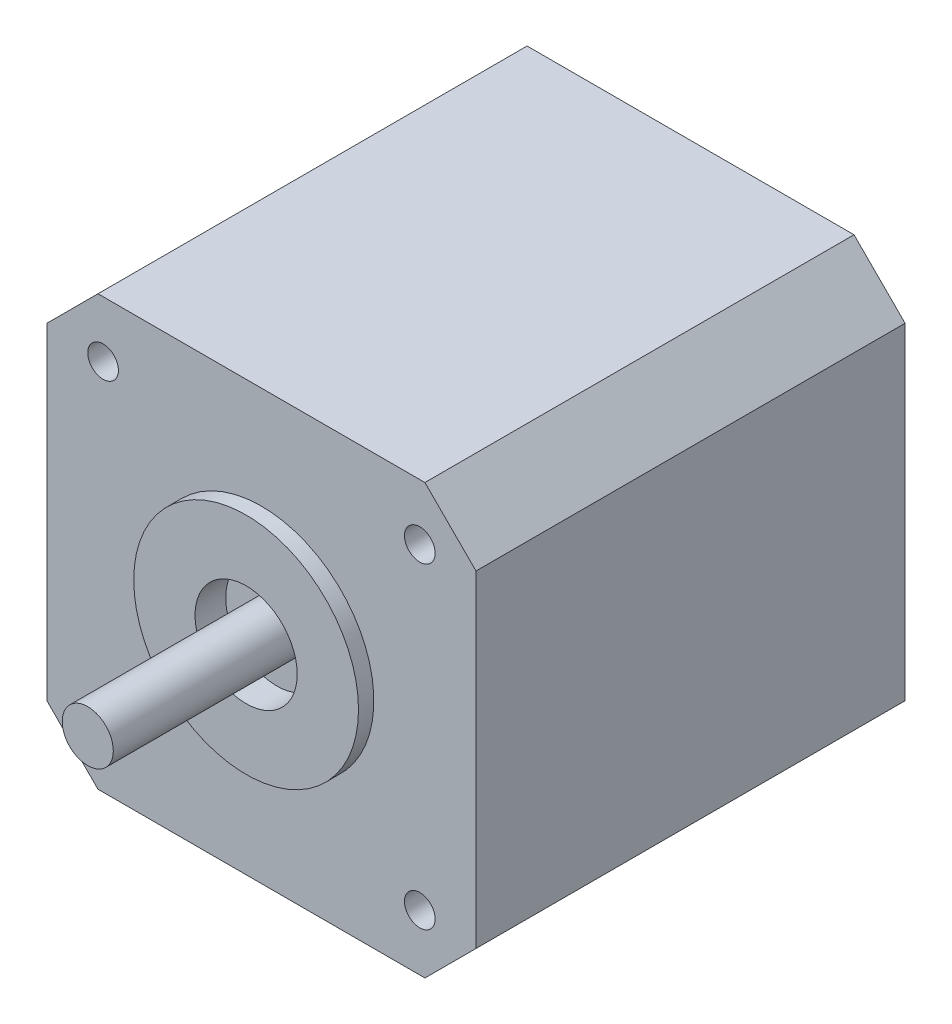
ISO-10303-21;
HEADER;
FILE_DESCRIPTION(('STEP AP214'),'2;1');
FILE_NAME('part.step','',(''),(''),'','','');
FILE_SCHEMA(('AUTOMOTIVE_DESIGN { 1 0 10303 214 1 1 1 1 }'));
ENDSEC;
DATA;
#1=APPLICATION_CONTEXT('core data for automotive mechanical design processes');
#2=APPLICATION_PROTOCOL_DEFINITION('international standard','automotive_design',2000,#1);
#3=PRODUCT_CONTEXT('',#1,'mechanical');
#4=PRODUCT('Part','Part','',(#3));
#5=PRODUCT_RELATED_PRODUCT_CATEGORY('part','',(#4));
#6=PRODUCT_DEFINITION_FORMATION('','',#4);
#7=PRODUCT_DEFINITION_CONTEXT('part definition',#1,'design');
#8=PRODUCT_DEFINITION('design','',#6,#7);
#9=PRODUCT_DEFINITION_SHAPE('','',#8);
#10=(LENGTH_UNIT() NAMED_UNIT(*) SI_UNIT(.MILLI.,.METRE.));
#11=(NAMED_UNIT(*) PLANE_ANGLE_UNIT() SI_UNIT($,.RADIAN.));
#12=(NAMED_UNIT(*) SI_UNIT($,.STERADIAN.) SOLID_ANGLE_UNIT());
#13=UNCERTAINTY_MEASURE_WITH_UNIT(LENGTH_MEASURE(1.E-05),#10,'distance_accuracy_value','');
#14=(GEOMETRIC_REPRESENTATION_CONTEXT(3) GLOBAL_UNCERTAINTY_ASSIGNED_CONTEXT((#13)) GLOBAL_UNIT_ASSIGNED_CONTEXT((#10,
#11,#12)) REPRESENTATION_CONTEXT('',''));
#15=CARTESIAN_POINT('',(0.,0.,0.));
#16=DIRECTION('',(0.,0.,1.));
#17=DIRECTION('',(1.,0.,0.));
#18=AXIS2_PLACEMENT_3D('',#15,#16,#17);
#19=CARTESIAN_POINT('',(21.,5.,21.));
#20=DIRECTION('',(0.707106781186547,-0.707106781186548,0.));
#21=DIRECTION('',(0.,0.,1.));
#22=AXIS2_PLACEMENT_3D('',#19,#20,#21);
#23=PLANE('',#22);
#24=DIRECTION('',(0.,0.,-1.));
#25=VECTOR('',#24,1.);
#26=CARTESIAN_POINT('',(21.,5.,21.));
#27=LINE('',#26,#25);
#28=CARTESIAN_POINT('',(21.,5.00000000000001,21.));
#29=VERTEX_POINT('',#28);
#30=CARTESIAN_POINT('',(21.,5.00000000000001,-21.));
#31=VERTEX_POINT('',#30);
#32=EDGE_CURVE('E189',#29,#31,#27,.T.);
#33=ORIENTED_EDGE('',*,*,#32,.F.);
#34=DIRECTION('',(0.707106781186548,0.707106781186547,0.));
#35=VECTOR('',#34,1.);
#36=CARTESIAN_POINT('',(21.,5.,21.));
#37=LINE('',#36,#35);
#38=CARTESIAN_POINT('',(16.,0.,21.));
#39=VERTEX_POINT('',#38);
#40=EDGE_CURVE('E53',#39,#29,#37,.T.);
#41=ORIENTED_EDGE('',*,*,#40,.F.);
#42=DIRECTION('',(0.,0.,1.));
#43=VECTOR('',#42,1.);
#44=CARTESIAN_POINT('',(16.,0.,21.));
#45=LINE('',#44,#43);
#46=CARTESIAN_POINT('',(16.,0.,-21.));
#47=VERTEX_POINT('',#46);
#48=EDGE_CURVE('E192',#47,#39,#45,.T.);
#49=ORIENTED_EDGE('',*,*,#48,.F.);
#50=DIRECTION('',(-0.707106781186548,-0.707106781186547,0.));
#51=VECTOR('',#50,1.);
#52=CARTESIAN_POINT('',(21.,5.,-21.));
#53=LINE('',#52,#51);
#54=EDGE_CURVE('E13',#31,#47,#53,.T.);
#55=ORIENTED_EDGE('',*,*,#54,.F.);
#56=EDGE_LOOP('',(#33,#41,#49,#55));
#57=FACE_BOUND('',#56,.T.);
#58=ADVANCED_FACE('F46',(#57),#23,.T.);
#59=CARTESIAN_POINT('',(-21.,5.,21.));
#60=DIRECTION('',(-0.707106781186547,-0.707106781186548,0.));
#61=DIRECTION('',(0.,0.,-1.));
#62=AXIS2_PLACEMENT_3D('',#59,#60,#61);
#63=PLANE('',#62);
#64=DIRECTION('',(0.,0.,1.));
#65=VECTOR('',#64,1.);
#66=CARTESIAN_POINT('',(-21.,5.,-21.));
#67=LINE('',#66,#65);
#68=CARTESIAN_POINT('',(-21.,5.00000000000001,-21.));
#69=VERTEX_POINT('',#68);
#70=CARTESIAN_POINT('',(-21.,5.00000000000001,21.));
#71=VERTEX_POINT('',#70);
#72=EDGE_CURVE('E179',#69,#71,#67,.T.);
#73=ORIENTED_EDGE('',*,*,#72,.F.);
#74=DIRECTION('',(-0.707106781186548,0.707106781186547,0.));
#75=VECTOR('',#74,1.);
#76=CARTESIAN_POINT('',(-21.,5.,-21.));
#77=LINE('',#76,#75);
#78=CARTESIAN_POINT('',(-16.,0.,-21.));
#79=VERTEX_POINT('',#78);
#80=EDGE_CURVE('E185',#79,#69,#77,.T.);
#81=ORIENTED_EDGE('',*,*,#80,.F.);
#82=DIRECTION('',(0.,0.,-1.));
#83=VECTOR('',#82,1.);
#84=CARTESIAN_POINT('',(-16.,0.,-21.));
#85=LINE('',#84,#83);
#86=CARTESIAN_POINT('',(-16.,0.,21.));
#87=VERTEX_POINT('',#86);
#88=EDGE_CURVE('E182',#87,#79,#85,.T.);
#89=ORIENTED_EDGE('',*,*,#88,.F.);
#90=DIRECTION('',(0.707106781186548,-0.707106781186547,0.));
#91=VECTOR('',#90,1.);
#92=CARTESIAN_POINT('',(-21.,5.,21.));
#93=LINE('',#92,#91);
#94=EDGE_CURVE('E187',#71,#87,#93,.T.);
#95=ORIENTED_EDGE('',*,*,#94,.F.);
#96=EDGE_LOOP('',(#73,#81,#89,#95));
#97=FACE_BOUND('',#96,.T.);
#98=ADVANCED_FACE('F214',(#97),#63,.T.);
#99=CARTESIAN_POINT('',(-16.,42.,0.));
#100=DIRECTION('',(0.707106781186547,-0.707106781186548,0.));
#101=DIRECTION('',(0.,0.,1.));
#102=AXIS2_PLACEMENT_3D('',#99,#100,#101);
#103=PLANE('',#102);
#104=DIRECTION('',(0.,0.,1.));
#105=VECTOR('',#104,1.);
#106=CARTESIAN_POINT('',(-16.,42.,0.));
#107=LINE('',#106,#105);
#108=CARTESIAN_POINT('',(-16.,42.,-21.));
#109=VERTEX_POINT('',#108);
#110=CARTESIAN_POINT('',(-16.,42.,21.));
#111=VERTEX_POINT('',#110);
#112=EDGE_CURVE('E115',#109,#111,#107,.T.);
#113=ORIENTED_EDGE('',*,*,#112,.F.);
#114=DIRECTION('',(-0.707106781186548,-0.707106781186547,0.));
#115=VECTOR('',#114,1.);
#116=CARTESIAN_POINT('',(-16.,42.,-21.));
#117=LINE('',#116,#115);
#118=CARTESIAN_POINT('',(-21.,37.,-21.));
#119=VERTEX_POINT('',#118);
#120=EDGE_CURVE('E130',#119,#109,#117,.F.);
#121=ORIENTED_EDGE('',*,*,#120,.F.);
#122=DIRECTION('',(0.,0.,-1.));
#123=VECTOR('',#122,1.);
#124=CARTESIAN_POINT('',(-21.,37.,21.));
#125=LINE('',#124,#123);
#126=CARTESIAN_POINT('',(-21.,37.,21.));
#127=VERTEX_POINT('',#126);
#128=EDGE_CURVE('E173',#127,#119,#125,.T.);
#129=ORIENTED_EDGE('',*,*,#128,.F.);
#130=DIRECTION('',(0.707106781186548,0.707106781186547,0.));
#131=VECTOR('',#130,1.);
#132=CARTESIAN_POINT('',(-16.,42.,21.));
#133=LINE('',#132,#131);
#134=EDGE_CURVE('E177',#111,#127,#133,.F.);
#135=ORIENTED_EDGE('',*,*,#134,.F.);
#136=EDGE_LOOP('',(#113,#121,#129,#135));
#137=FACE_BOUND('',#136,.T.);
#138=ADVANCED_FACE('F218',(#137),#103,.F.);
#139=CARTESIAN_POINT('',(16.,42.,0.));
#140=DIRECTION('',(-0.707106781186547,-0.707106781186548,0.));
#141=DIRECTION('',(0.,0.,-1.));
#142=AXIS2_PLACEMENT_3D('',#139,#140,#141);
#143=PLANE('',#142);
#144=DIRECTION('',(0.,0.,-1.));
#145=VECTOR('',#144,1.);
#146=CARTESIAN_POINT('',(16.,42.,0.));
#147=LINE('',#146,#145);
#148=CARTESIAN_POINT('',(16.,42.,21.));
#149=VERTEX_POINT('',#148);
#150=CARTESIAN_POINT('',(16.,42.,-21.));
#151=VERTEX_POINT('',#150);
#152=EDGE_CURVE('E110',#149,#151,#147,.T.);
#153=ORIENTED_EDGE('',*,*,#152,.F.);
#154=DIRECTION('',(0.707106781186548,-0.707106781186547,0.));
#155=VECTOR('',#154,1.);
#156=CARTESIAN_POINT('',(16.,42.,21.));
#157=LINE('',#156,#155);
#158=CARTESIAN_POINT('',(21.,37.,21.));
#159=VERTEX_POINT('',#158);
#160=EDGE_CURVE('E116',#159,#149,#157,.F.);
#161=ORIENTED_EDGE('',*,*,#160,.F.);
#162=DIRECTION('',(0.,0.,1.));
#163=VECTOR('',#162,1.);
#164=CARTESIAN_POINT('',(21.,37.,21.));
#165=LINE('',#164,#163);
#166=CARTESIAN_POINT('',(21.,37.,-21.));
#167=VERTEX_POINT('',#166);
#168=EDGE_CURVE('E112',#167,#159,#165,.T.);
#169=ORIENTED_EDGE('',*,*,#168,.F.);
#170=DIRECTION('',(-0.707106781186548,0.707106781186547,0.));
#171=VECTOR('',#170,1.);
#172=CARTESIAN_POINT('',(16.,42.,-21.));
#173=LINE('',#172,#171);
#174=EDGE_CURVE('E107',#151,#167,#173,.F.);
#175=ORIENTED_EDGE('',*,*,#174,.F.);
#176=EDGE_LOOP('',(#153,#161,#169,#175));
#177=FACE_BOUND('',#176,.T.);
#178=ADVANCED_FACE('F109',(#177),#143,.F.);
#179=CARTESIAN_POINT('',(15.5,36.5,-21.));
#180=DIRECTION('',(0.,0.,1.));
#181=DIRECTION('',(1.,0.,0.));
#182=AXIS2_PLACEMENT_3D('',#179,#180,#181);
#183=CYLINDRICAL_SURFACE('',#182,1.5);
#184=CARTESIAN_POINT('',(15.5,36.5,21.));
#185=DIRECTION('',(0.,0.,1.));
#186=DIRECTION('',(1.,0.,0.));
#187=AXIS2_PLACEMENT_3D('',#184,#185,#186);
#188=CIRCLE('',#187,1.5);
#189=CARTESIAN_POINT('',(17.,36.5,21.));
#190=VERTEX_POINT('',#189);
#191=EDGE_CURVE('E140',#190,#190,#188,.T.);
#192=CARTESIAN_POINT('',(15.5,36.5,-19.));
#193=DIRECTION('',(0.,0.,-1.));
#194=DIRECTION('',(-1.,0.,0.));
#195=AXIS2_PLACEMENT_3D('',#192,#193,#194);
#196=CIRCLE('',#195,1.5);
#197=CARTESIAN_POINT('',(17.,36.5,-19.));
#198=VERTEX_POINT('',#197);
#199=EDGE_CURVE('E166',#198,#198,#196,.F.);
#200=CARTESIAN_POINT('',(17.,36.5,21.));
#201=CARTESIAN_POINT('',(17.,36.5,20.5833333333333));
#202=CARTESIAN_POINT('',(17.,36.5,20.1666666666667));
#203=CARTESIAN_POINT('',(17.,36.5,19.3333333333333));
#204=CARTESIAN_POINT('',(17.,36.5,18.9166666666667));
#205=CARTESIAN_POINT('',(17.,36.5,18.0833333333333));
#206=CARTESIAN_POINT('',(17.,36.5,17.6666666666667));
#207=CARTESIAN_POINT('',(17.,36.5,16.8333333333333));
#208=CARTESIAN_POINT('',(17.,36.5,16.4166666666667));
#209=CARTESIAN_POINT('',(17.,36.5,15.5833333333333));
#210=CARTESIAN_POINT('',(17.,36.5,15.1666666666667));
#211=CARTESIAN_POINT('',(17.,36.5,14.3333333333333));
#212=CARTESIAN_POINT('',(17.,36.5,13.9166666666667));
#213=CARTESIAN_POINT('',(17.,36.5,13.0833333333333));
#214=CARTESIAN_POINT('',(17.,36.5,12.6666666666667));
#215=CARTESIAN_POINT('',(17.,36.5,11.8333333333333));
#216=CARTESIAN_POINT('',(17.,36.5,11.4166666666667));
#217=CARTESIAN_POINT('',(17.,36.5,10.5833333333333));
#218=CARTESIAN_POINT('',(17.,36.5,10.1666666666667));
#219=CARTESIAN_POINT('',(17.,36.5,9.33333333333333));
#220=CARTESIAN_POINT('',(17.,36.5,8.91666666666667));
#221=CARTESIAN_POINT('',(17.,36.5,8.08333333333333));
#222=CARTESIAN_POINT('',(17.,36.5,7.66666666666667));
#223=CARTESIAN_POINT('',(17.,36.5,6.83333333333334));
#224=CARTESIAN_POINT('',(17.,36.5,6.41666666666667));
#225=CARTESIAN_POINT('',(17.,36.5,5.58333333333333));
#226=CARTESIAN_POINT('',(17.,36.5,5.16666666666667));
#227=CARTESIAN_POINT('',(17.,36.5,4.33333333333333));
#228=CARTESIAN_POINT('',(17.,36.5,3.91666666666667));
#229=CARTESIAN_POINT('',(17.,36.5,3.08333333333334));
#230=CARTESIAN_POINT('',(17.,36.5,2.66666666666667));
#231=CARTESIAN_POINT('',(17.,36.5,1.83333333333334));
#232=CARTESIAN_POINT('',(17.,36.5,1.41666666666667));
#233=CARTESIAN_POINT('',(17.,36.5,0.583333333333334));
#234=CARTESIAN_POINT('',(17.,36.5,0.166666666666667));
#235=CARTESIAN_POINT('',(17.,36.5,-0.666666666666667));
#236=CARTESIAN_POINT('',(17.,36.5,-1.08333333333333));
#237=CARTESIAN_POINT('',(17.,36.5,-1.91666666666667));
#238=CARTESIAN_POINT('',(17.,36.5,-2.33333333333333));
#239=CARTESIAN_POINT('',(17.,36.5,-3.16666666666667));
#240=CARTESIAN_POINT('',(17.,36.5,-3.58333333333333));
#241=CARTESIAN_POINT('',(17.,36.5,-4.41666666666667));
#242=CARTESIAN_POINT('',(17.,36.5,-4.83333333333333));
#243=CARTESIAN_POINT('',(17.,36.5,-5.66666666666667));
#244=CARTESIAN_POINT('',(17.,36.5,-6.08333333333333));
#245=CARTESIAN_POINT('',(17.,36.5,-6.91666666666666));
#246=CARTESIAN_POINT('',(17.,36.5,-7.33333333333333));
#247=CARTESIAN_POINT('',(17.,36.5,-8.16666666666667));
#248=CARTESIAN_POINT('',(17.,36.5,-8.58333333333333));
#249=CARTESIAN_POINT('',(17.,36.5,-9.41666666666667));
#250=CARTESIAN_POINT('',(17.,36.5,-9.83333333333333));
#251=CARTESIAN_POINT('',(17.,36.5,-10.6666666666667));
#252=CARTESIAN_POINT('',(17.,36.5,-11.0833333333333));
#253=CARTESIAN_POINT('',(17.,36.5,-11.9166666666667));
#254=CARTESIAN_POINT('',(17.,36.5,-12.3333333333333));
#255=CARTESIAN_POINT('',(17.,36.5,-13.1666666666667));
#256=CARTESIAN_POINT('',(17.,36.5,-13.5833333333333));
#257=CARTESIAN_POINT('',(17.,36.5,-14.4166666666667));
#258=CARTESIAN_POINT('',(17.,36.5,-14.8333333333333));
#259=CARTESIAN_POINT('',(17.,36.5,-15.6666666666667));
#260=CARTESIAN_POINT('',(17.,36.5,-16.0833333333333));
#261=CARTESIAN_POINT('',(17.,36.5,-16.9166666666667));
#262=CARTESIAN_POINT('',(17.,36.5,-17.3333333333333));
#263=CARTESIAN_POINT('',(17.,36.5,-18.1666666666667));
#264=CARTESIAN_POINT('',(17.,36.5,-18.5833333333333));
#265=CARTESIAN_POINT('',(17.,36.5,-19.));
#266=B_SPLINE_CURVE_WITH_KNOTS('',3,(#200,#201,#202,#203,#204,#205,#206,#207,#208,#209,#210,
#211,#212,#213,#214,#215,#216,#217,#218,#219,#220,#221,#222,#223,#224,#225,#226,#227,#228,#229,
#230,#231,#232,#233,#234,#235,#236,#237,#238,#239,#240,#241,#242,#243,#244,#245,#246,#247,#248,
#249,#250,#251,#252,#253,#254,#255,#256,#257,#258,#259,#260,#261,#262,#263,#264,#265),
.UNSPECIFIED.,.F.,.F.,(4,2,2,2,2,2,2,2,2,2,2,2,2,2,2,2,2,2,2,2,2,2,2,2,2,2,2,2,2,2,2,2,4),(0.,
1.25,2.5,3.75,5.,6.25,7.5,8.75,10.,11.25,12.5,13.75,15.,16.25,17.5,18.75,20.,21.25,22.5,23.75,
25.,26.25,27.5,28.75,30.,31.25,32.5,33.75,35.,36.25,37.5,38.75,40.),.UNSPECIFIED.);
#267=EDGE_CURVE('BSEAM209',#190,#198,#266,.T.);
#268=ORIENTED_EDGE('',*,*,#191,.T.);
#269=ORIENTED_EDGE('',*,*,#199,.F.);
#270=ORIENTED_EDGE('',*,*,#267,.T.);
#271=ORIENTED_EDGE('',*,*,#267,.F.);
#272=EDGE_LOOP('',(#268,#270,#269,#271));
#273=FACE_BOUND('',#272,.T.);
#274=ADVANCED_FACE('F209',(#273),#183,.F.);
#275=CARTESIAN_POINT('',(-15.5,5.50000000000001,-21.));
#276=DIRECTION('',(0.,0.,1.));
#277=DIRECTION('',(1.,0.,0.));
#278=AXIS2_PLACEMENT_3D('',#275,#276,#277);
#279=CYLINDRICAL_SURFACE('',#278,1.5);
#280=CARTESIAN_POINT('',(-15.5,5.50000000000001,21.));
#281=DIRECTION('',(0.,0.,1.));
#282=DIRECTION('',(1.,0.,0.));
#283=AXIS2_PLACEMENT_3D('',#280,#281,#282);
#284=CIRCLE('',#283,1.5);
#285=CARTESIAN_POINT('',(-14.,5.50000000000001,21.));
#286=VERTEX_POINT('',#285);
#287=EDGE_CURVE('E519',#286,#286,#284,.T.);
#288=CARTESIAN_POINT('',(-15.5,5.50000000000001,-19.));
#289=DIRECTION('',(0.,0.,-1.));
#290=DIRECTION('',(-1.,0.,0.));
#291=AXIS2_PLACEMENT_3D('',#288,#289,#290);
#292=CIRCLE('',#291,1.5);
#293=CARTESIAN_POINT('',(-14.,5.50000000000001,-19.));
#294=VERTEX_POINT('',#293);
#295=EDGE_CURVE('E163',#294,#294,#292,.F.);
#296=CARTESIAN_POINT('',(-14.,5.50000000000001,21.));
#297=CARTESIAN_POINT('',(-14.,5.50000000000001,20.5833333333333));
#298=CARTESIAN_POINT('',(-14.,5.50000000000001,20.1666666666667));
#299=CARTESIAN_POINT('',(-14.,5.50000000000001,19.3333333333333));
#300=CARTESIAN_POINT('',(-14.,5.50000000000001,18.9166666666667));
#301=CARTESIAN_POINT('',(-14.,5.50000000000001,18.0833333333333));
#302=CARTESIAN_POINT('',(-14.,5.50000000000001,17.6666666666667));
#303=CARTESIAN_POINT('',(-14.,5.50000000000001,16.8333333333333));
#304=CARTESIAN_POINT('',(-14.,5.50000000000001,16.4166666666667));
#305=CARTESIAN_POINT('',(-14.,5.50000000000001,15.5833333333333));
#306=CARTESIAN_POINT('',(-14.,5.50000000000001,15.1666666666667));
#307=CARTESIAN_POINT('',(-14.,5.50000000000001,14.3333333333333));
#308=CARTESIAN_POINT('',(-14.,5.50000000000001,13.9166666666667));
#309=CARTESIAN_POINT('',(-14.,5.50000000000001,13.0833333333333));
#310=CARTESIAN_POINT('',(-14.,5.50000000000001,12.6666666666667));
#311=CARTESIAN_POINT('',(-14.,5.50000000000001,11.8333333333333));
#312=CARTESIAN_POINT('',(-14.,5.50000000000001,11.4166666666667));
#313=CARTESIAN_POINT('',(-14.,5.50000000000001,10.5833333333333));
#314=CARTESIAN_POINT('',(-14.,5.50000000000001,10.1666666666667));
#315=CARTESIAN_POINT('',(-14.,5.50000000000001,9.33333333333333));
#316=CARTESIAN_POINT('',(-14.,5.50000000000001,8.91666666666667));
#317=CARTESIAN_POINT('',(-14.,5.50000000000001,8.08333333333333));
#318=CARTESIAN_POINT('',(-14.,5.50000000000001,7.66666666666667));
#319=CARTESIAN_POINT('',(-14.,5.50000000000001,6.83333333333334));
#320=CARTESIAN_POINT('',(-14.,5.50000000000001,6.41666666666667));
#321=CARTESIAN_POINT('',(-14.,5.50000000000001,5.58333333333333));
#322=CARTESIAN_POINT('',(-14.,5.50000000000001,5.16666666666667));
#323=CARTESIAN_POINT('',(-14.,5.50000000000001,4.33333333333333));
#324=CARTESIAN_POINT('',(-14.,5.50000000000001,3.91666666666667));
#325=CARTESIAN_POINT('',(-14.,5.50000000000001,3.08333333333334));
#326=CARTESIAN_POINT('',(-14.,5.50000000000001,2.66666666666667));
#327=CARTESIAN_POINT('',(-14.,5.50000000000001,1.83333333333334));
#328=CARTESIAN_POINT('',(-14.,5.50000000000001,1.41666666666667));
#329=CARTESIAN_POINT('',(-14.,5.50000000000001,0.583333333333334));
#330=CARTESIAN_POINT('',(-14.,5.50000000000001,0.166666666666667));
#331=CARTESIAN_POINT('',(-14.,5.50000000000001,-0.666666666666667));
#332=CARTESIAN_POINT('',(-14.,5.50000000000001,-1.08333333333333));
#333=CARTESIAN_POINT('',(-14.,5.50000000000001,-1.91666666666667));
#334=CARTESIAN_POINT('',(-14.,5.50000000000001,-2.33333333333333));
#335=CARTESIAN_POINT('',(-14.,5.50000000000001,-3.16666666666667));
#336=CARTESIAN_POINT('',(-14.,5.50000000000001,-3.58333333333333));
#337=CARTESIAN_POINT('',(-14.,5.50000000000001,-4.41666666666667));
#338=CARTESIAN_POINT('',(-14.,5.50000000000001,-4.83333333333333));
#339=CARTESIAN_POINT('',(-14.,5.50000000000001,-5.66666666666667));
#340=CARTESIAN_POINT('',(-14.,5.50000000000001,-6.08333333333333));
#341=CARTESIAN_POINT('',(-14.,5.50000000000001,-6.91666666666666));
#342=CARTESIAN_POINT('',(-14.,5.50000000000001,-7.33333333333333));
#343=CARTESIAN_POINT('',(-14.,5.50000000000001,-8.16666666666667));
#344=CARTESIAN_POINT('',(-14.,5.50000000000001,-8.58333333333333));
#345=CARTESIAN_POINT('',(-14.,5.50000000000001,-9.41666666666667));
#346=CARTESIAN_POINT('',(-14.,5.50000000000001,-9.83333333333333));
#347=CARTESIAN_POINT('',(-14.,5.50000000000001,-10.6666666666667));
#348=CARTESIAN_POINT('',(-14.,5.50000000000001,-11.0833333333333));
#349=CARTESIAN_POINT('',(-14.,5.50000000000001,-11.9166666666667));
#350=CARTESIAN_POINT('',(-14.,5.50000000000001,-12.3333333333333));
#351=CARTESIAN_POINT('',(-14.,5.50000000000001,-13.1666666666667));
#352=CARTESIAN_POINT('',(-14.,5.50000000000001,-13.5833333333333));
#353=CARTESIAN_POINT('',(-14.,5.50000000000001,-14.4166666666667));
#354=CARTESIAN_POINT('',(-14.,5.50000000000001,-14.8333333333333));
#355=CARTESIAN_POINT('',(-14.,5.50000000000001,-15.6666666666667));
#356=CARTESIAN_POINT('',(-14.,5.50000000000001,-16.0833333333333));
#357=CARTESIAN_POINT('',(-14.,5.50000000000001,-16.9166666666667));
#358=CARTESIAN_POINT('',(-14.,5.50000000000001,-17.3333333333333));
#359=CARTESIAN_POINT('',(-14.,5.50000000000001,-18.1666666666667));
#360=CARTESIAN_POINT('',(-14.,5.50000000000001,-18.5833333333333));
#361=CARTESIAN_POINT('',(-14.,5.50000000000001,-19.));
#362=B_SPLINE_CURVE_WITH_KNOTS('',3,(#296,#297,#298,#299,#300,#301,#302,#303,#304,#305,#306,
#307,#308,#309,#310,#311,#312,#313,#314,#315,#316,#317,#318,#319,#320,#321,#322,#323,#324,#325,
#326,#327,#328,#329,#330,#331,#332,#333,#334,#335,#336,#337,#338,#339,#340,#341,#342,#343,#344,
#345,#346,#347,#348,#349,#350,#351,#352,#353,#354,#355,#356,#357,#358,#359,#360,#361),
.UNSPECIFIED.,.F.,.F.,(4,2,2,2,2,2,2,2,2,2,2,2,2,2,2,2,2,2,2,2,2,2,2,2,2,2,2,2,2,2,2,2,4),(0.,
1.25,2.5,3.75,5.,6.25,7.5,8.75,10.,11.25,12.5,13.75,15.,16.25,17.5,18.75,20.,21.25,22.5,23.75,
25.,26.25,27.5,28.75,30.,31.25,32.5,33.75,35.,36.25,37.5,38.75,40.),.UNSPECIFIED.);
#363=EDGE_CURVE('BSEAM200',#286,#294,#362,.T.);
#364=ORIENTED_EDGE('',*,*,#287,.T.);
#365=ORIENTED_EDGE('',*,*,#295,.F.);
#366=ORIENTED_EDGE('',*,*,#363,.T.);
#367=ORIENTED_EDGE('',*,*,#363,.F.);
#368=EDGE_LOOP('',(#364,#366,#365,#367));
#369=FACE_BOUND('',#368,.T.);
#370=ADVANCED_FACE('F200',(#369),#279,.F.);
#371=CARTESIAN_POINT('',(21.,42.,21.));
#372=DIRECTION('',(-1.,0.,0.));
#373=DIRECTION('',(0.,0.,1.));
#374=AXIS2_PLACEMENT_3D('',#371,#372,#373);
#375=PLANE('',#374);
#376=DIRECTION('',(0.,-1.,0.));
#377=VECTOR('',#376,1.);
#378=CARTESIAN_POINT('',(21.,42.,21.));
#379=LINE('',#378,#377);
#380=EDGE_CURVE('E134',#159,#29,#379,.T.);
#381=ORIENTED_EDGE('',*,*,#380,.T.);
#382=ORIENTED_EDGE('',*,*,#32,.T.);
#383=DIRECTION('',(0.,-1.,0.));
#384=VECTOR('',#383,1.);
#385=CARTESIAN_POINT('',(21.,42.,-21.));
#386=LINE('',#385,#384);
#387=EDGE_CURVE('E152',#167,#31,#386,.T.);
#388=ORIENTED_EDGE('',*,*,#387,.F.);
#389=ORIENTED_EDGE('',*,*,#168,.T.);
#390=EDGE_LOOP('',(#381,#382,#388,#389));
#391=FACE_BOUND('',#390,.T.);
#392=ADVANCED_FACE('F198',(#391),#375,.F.);
#393=CARTESIAN_POINT('',(-21.,42.,-21.));
#394=DIRECTION('',(0.,0.,1.));
#395=DIRECTION('',(1.,0.,0.));
#396=AXIS2_PLACEMENT_3D('',#393,#394,#395);
#397=PLANE('',#396);
#398=CARTESIAN_POINT('',(-15.5,36.5,-21.));
#399=DIRECTION('',(0.,0.,-1.));
#400=DIRECTION('',(1.,0.,0.));
#401=AXIS2_PLACEMENT_3D('',#398,#399,#400);
#402=CIRCLE('',#401,3.);
#403=CARTESIAN_POINT('',(-12.5,36.5,-21.));
#404=VERTEX_POINT('',#403);
#405=EDGE_CURVE('E493',#404,#404,#402,.T.);
#406=ORIENTED_EDGE('',*,*,#405,.F.);
#407=EDGE_LOOP('',(#406));
#408=FACE_BOUND('',#407,.T.);
#409=CARTESIAN_POINT('',(15.5,5.50000000000001,-21.));
#410=DIRECTION('',(0.,0.,-1.));
#411=DIRECTION('',(1.,0.,0.));
#412=AXIS2_PLACEMENT_3D('',#409,#410,#411);
#413=CIRCLE('',#412,3.);
#414=CARTESIAN_POINT('',(18.5,5.50000000000001,-21.));
#415=VERTEX_POINT('',#414);
#416=EDGE_CURVE('E486',#415,#415,#413,.T.);
#417=ORIENTED_EDGE('',*,*,#416,.F.);
#418=EDGE_LOOP('',(#417));
#419=FACE_BOUND('',#418,.T.);
#420=CARTESIAN_POINT('',(15.5,36.5,-21.));
#421=DIRECTION('',(0.,0.,-1.));
#422=DIRECTION('',(-1.,0.,0.));
#423=AXIS2_PLACEMENT_3D('',#420,#421,#422);
#424=CIRCLE('',#423,3.);
#425=CARTESIAN_POINT('',(12.5,36.5,-21.));
#426=VERTEX_POINT('',#425);
#427=EDGE_CURVE('E483',#426,#426,#424,.T.);
#428=ORIENTED_EDGE('',*,*,#427,.F.);
#429=EDGE_LOOP('',(#428));
#430=FACE_BOUND('',#429,.T.);
#431=CARTESIAN_POINT('',(-15.5,5.50000000000001,-21.));
#432=DIRECTION('',(0.,0.,-1.));
#433=DIRECTION('',(-1.,0.,0.));
#434=AXIS2_PLACEMENT_3D('',#431,#432,#433);
#435=CIRCLE('',#434,3.);
#436=CARTESIAN_POINT('',(-18.5,5.50000000000001,-21.));
#437=VERTEX_POINT('',#436);
#438=EDGE_CURVE('E492',#437,#437,#435,.T.);
#439=ORIENTED_EDGE('',*,*,#438,.F.);
#440=EDGE_LOOP('',(#439));
#441=FACE_BOUND('',#440,.T.);
#442=ORIENTED_EDGE('',*,*,#387,.T.);
#443=ORIENTED_EDGE('',*,*,#54,.T.);
#444=DIRECTION('',(-1.,0.,0.));
#445=VECTOR('',#444,1.);
#446=CARTESIAN_POINT('',(-21.,0.,-21.));
#447=LINE('',#446,#445);
#448=EDGE_CURVE('E137',#47,#79,#447,.T.);
#449=ORIENTED_EDGE('',*,*,#448,.T.);
#450=ORIENTED_EDGE('',*,*,#80,.T.);
#451=DIRECTION('',(0.,-1.,0.));
#452=VECTOR('',#451,1.);
#453=CARTESIAN_POINT('',(-21.,42.,-21.));
#454=LINE('',#453,#452);
#455=EDGE_CURVE('E149',#119,#69,#454,.T.);
#456=ORIENTED_EDGE('',*,*,#455,.F.);
#457=ORIENTED_EDGE('',*,*,#120,.T.);
#458=DIRECTION('',(-1.,0.,0.));
#459=VECTOR('',#458,1.);
#460=CARTESIAN_POINT('',(-21.,42.,-21.));
#461=LINE('',#460,#459);
#462=EDGE_CURVE('E122',#151,#109,#461,.T.);
#463=ORIENTED_EDGE('',*,*,#462,.F.);
#464=ORIENTED_EDGE('',*,*,#174,.T.);
#465=EDGE_LOOP('',(#442,#443,#449,#450,#456,#457,#463,#464));
#466=FACE_BOUND('',#465,.T.);
#467=ADVANCED_FACE('F128',(#408,#419,#430,#441,#466),#397,.F.);
#468=CARTESIAN_POINT('',(-21.,42.,21.));
#469=DIRECTION('',(1.,0.,0.));
#470=DIRECTION('',(0.,0.,-1.));
#471=AXIS2_PLACEMENT_3D('',#468,#469,#470);
#472=PLANE('',#471);
#473=ORIENTED_EDGE('',*,*,#455,.T.);
#474=ORIENTED_EDGE('',*,*,#72,.T.);
#475=DIRECTION('',(0.,-1.,0.));
#476=VECTOR('',#475,1.);
#477=CARTESIAN_POINT('',(-21.,42.,21.));
#478=LINE('',#477,#476);
#479=EDGE_CURVE('E146',#127,#71,#478,.T.);
#480=ORIENTED_EDGE('',*,*,#479,.F.);
#481=ORIENTED_EDGE('',*,*,#128,.T.);
#482=EDGE_LOOP('',(#473,#474,#480,#481));
#483=FACE_BOUND('',#482,.T.);
#484=ADVANCED_FACE('F206',(#483),#472,.F.);
#485=CARTESIAN_POINT('',(-21.,42.,21.));
#486=DIRECTION('',(0.,0.,-1.));
#487=DIRECTION('',(-1.,0.,0.));
#488=AXIS2_PLACEMENT_3D('',#485,#486,#487);
#489=PLANE('',#488);
#490=CARTESIAN_POINT('',(0.,21.,21.));
#491=DIRECTION('',(0.,0.,-1.));
#492=DIRECTION('',(-1.,0.,0.));
#493=AXIS2_PLACEMENT_3D('',#490,#491,#492);
#494=CIRCLE('',#493,11.);
#495=CARTESIAN_POINT('',(-11.,21.,21.));
#496=VERTEX_POINT('',#495);
#497=EDGE_CURVE('E126',#496,#496,#494,.F.);
#498=ORIENTED_EDGE('',*,*,#497,.F.);
#499=EDGE_LOOP('',(#498));
#500=FACE_BOUND('',#499,.T.);
#501=CARTESIAN_POINT('',(-15.5,36.5,21.));
#502=DIRECTION('',(0.,0.,1.));
#503=DIRECTION('',(-1.,0.,0.));
#504=AXIS2_PLACEMENT_3D('',#501,#502,#503);
#505=CIRCLE('',#504,1.5);
#506=CARTESIAN_POINT('',(-14.,36.5,21.));
#507=VERTEX_POINT('',#506);
#508=EDGE_CURVE('E523',#507,#507,#505,.T.);
#509=ORIENTED_EDGE('',*,*,#508,.F.);
#510=EDGE_LOOP('',(#509));
#511=FACE_BOUND('',#510,.T.);
#512=CARTESIAN_POINT('',(15.5,5.50000000000001,21.));
#513=DIRECTION('',(0.,0.,1.));
#514=DIRECTION('',(-1.,0.,0.));
#515=AXIS2_PLACEMENT_3D('',#512,#513,#514);
#516=CIRCLE('',#515,1.5);
#517=CARTESIAN_POINT('',(17.,5.50000000000001,21.));
#518=VERTEX_POINT('',#517);
#519=EDGE_CURVE('E522',#518,#518,#516,.T.);
#520=ORIENTED_EDGE('',*,*,#519,.F.);
#521=EDGE_LOOP('',(#520));
#522=FACE_BOUND('',#521,.T.);
#523=ORIENTED_EDGE('',*,*,#287,.F.);
#524=EDGE_LOOP('',(#523));
#525=FACE_BOUND('',#524,.T.);
#526=ORIENTED_EDGE('',*,*,#191,.F.);
#527=EDGE_LOOP('',(#526));
#528=FACE_BOUND('',#527,.T.);
#529=DIRECTION('',(1.,0.,0.));
#530=VECTOR('',#529,1.);
#531=CARTESIAN_POINT('',(-21.,0.,21.));
#532=LINE('',#531,#530);
#533=EDGE_CURVE('E132',#87,#39,#532,.T.);
#534=ORIENTED_EDGE('',*,*,#533,.T.);
#535=ORIENTED_EDGE('',*,*,#40,.T.);
#536=ORIENTED_EDGE('',*,*,#380,.F.);
#537=ORIENTED_EDGE('',*,*,#160,.T.);
#538=DIRECTION('',(1.,0.,0.));
#539=VECTOR('',#538,1.);
#540=CARTESIAN_POINT('',(-21.,42.,21.));
#541=LINE('',#540,#539);
#542=EDGE_CURVE('E124',#111,#149,#541,.T.);
#543=ORIENTED_EDGE('',*,*,#542,.F.);
#544=ORIENTED_EDGE('',*,*,#134,.T.);
#545=ORIENTED_EDGE('',*,*,#479,.T.);
#546=ORIENTED_EDGE('',*,*,#94,.T.);
#547=EDGE_LOOP('',(#534,#535,#536,#537,#543,#544,#545,#546));
#548=FACE_BOUND('',#547,.T.);
#549=ADVANCED_FACE('F195',(#500,#511,#522,#525,#528,#548),#489,.F.);
#550=CARTESIAN_POINT('',(0.,42.,0.));
#551=DIRECTION('',(0.,-1.,0.));
#552=DIRECTION('',(0.,0.,-1.));
#553=AXIS2_PLACEMENT_3D('',#550,#551,#552);
#554=PLANE('',#553);
#555=ORIENTED_EDGE('',*,*,#462,.T.);
#556=ORIENTED_EDGE('',*,*,#112,.T.);
#557=ORIENTED_EDGE('',*,*,#542,.T.);
#558=ORIENTED_EDGE('',*,*,#152,.T.);
#559=EDGE_LOOP('',(#555,#556,#557,#558));
#560=FACE_BOUND('',#559,.T.);
#561=ADVANCED_FACE('F120',(#560),#554,.F.);
#562=CARTESIAN_POINT('',(0.,0.,0.));
#563=DIRECTION('',(0.,-1.,0.));
#564=DIRECTION('',(0.,0.,-1.));
#565=AXIS2_PLACEMENT_3D('',#562,#563,#564);
#566=PLANE('',#565);
#567=ORIENTED_EDGE('',*,*,#448,.F.);
#568=ORIENTED_EDGE('',*,*,#48,.T.);
#569=ORIENTED_EDGE('',*,*,#533,.F.);
#570=ORIENTED_EDGE('',*,*,#88,.T.);
#571=EDGE_LOOP('',(#567,#568,#569,#570));
#572=FACE_BOUND('',#571,.T.);
#573=ADVANCED_FACE('F242',(#572),#566,.T.);
#574=CARTESIAN_POINT('',(15.5,5.50000000000001,-21.));
#575=DIRECTION('',(0.,0.,1.));
#576=DIRECTION('',(1.,0.,0.));
#577=AXIS2_PLACEMENT_3D('',#574,#575,#576);
#578=CYLINDRICAL_SURFACE('',#577,1.5);
#579=CARTESIAN_POINT('',(15.5,5.50000000000001,-19.));
#580=DIRECTION('',(0.,0.,1.));
#581=DIRECTION('',(1.,0.,0.));
#582=AXIS2_PLACEMENT_3D('',#579,#580,#581);
#583=CIRCLE('',#582,1.5);
#584=CARTESIAN_POINT('',(17.,5.50000000000001,-19.));
#585=VERTEX_POINT('',#584);
#586=EDGE_CURVE('E159',#585,#585,#583,.F.);
#587=CARTESIAN_POINT('',(17.,5.50000000000001,-19.));
#588=CARTESIAN_POINT('',(17.,5.50000000000001,-18.5833333333333));
#589=CARTESIAN_POINT('',(17.,5.50000000000001,-18.1666666666667));
#590=CARTESIAN_POINT('',(17.,5.50000000000001,-17.3333333333333));
#591=CARTESIAN_POINT('',(17.,5.50000000000001,-16.9166666666667));
#592=CARTESIAN_POINT('',(17.,5.50000000000001,-16.0833333333333));
#593=CARTESIAN_POINT('',(17.,5.50000000000001,-15.6666666666667));
#594=CARTESIAN_POINT('',(17.,5.50000000000001,-14.8333333333333));
#595=CARTESIAN_POINT('',(17.,5.50000000000001,-14.4166666666667));
#596=CARTESIAN_POINT('',(17.,5.50000000000001,-13.5833333333333));
#597=CARTESIAN_POINT('',(17.,5.50000000000001,-13.1666666666667));
#598=CARTESIAN_POINT('',(17.,5.50000000000001,-12.3333333333333));
#599=CARTESIAN_POINT('',(17.,5.50000000000001,-11.9166666666667));
#600=CARTESIAN_POINT('',(17.,5.50000000000001,-11.0833333333333));
#601=CARTESIAN_POINT('',(17.,5.50000000000001,-10.6666666666667));
#602=CARTESIAN_POINT('',(17.,5.50000000000001,-9.83333333333334));
#603=CARTESIAN_POINT('',(17.,5.50000000000001,-9.41666666666667));
#604=CARTESIAN_POINT('',(17.,5.50000000000001,-8.58333333333334));
#605=CARTESIAN_POINT('',(17.,5.50000000000001,-8.16666666666667));
#606=CARTESIAN_POINT('',(17.,5.50000000000001,-7.33333333333333));
#607=CARTESIAN_POINT('',(17.,5.50000000000001,-6.91666666666667));
#608=CARTESIAN_POINT('',(17.,5.50000000000001,-6.08333333333334));
#609=CARTESIAN_POINT('',(17.,5.50000000000001,-5.66666666666667));
#610=CARTESIAN_POINT('',(17.,5.50000000000001,-4.83333333333334));
#611=CARTESIAN_POINT('',(17.,5.50000000000001,-4.41666666666667));
#612=CARTESIAN_POINT('',(17.,5.50000000000001,-3.58333333333334));
#613=CARTESIAN_POINT('',(17.,5.50000000000001,-3.16666666666667));
#614=CARTESIAN_POINT('',(17.,5.50000000000001,-2.33333333333334));
#615=CARTESIAN_POINT('',(17.,5.50000000000001,-1.91666666666667));
#616=CARTESIAN_POINT('',(17.,5.50000000000001,-1.08333333333333));
#617=CARTESIAN_POINT('',(17.,5.50000000000001,-0.666666666666667));
#618=CARTESIAN_POINT('',(17.,5.50000000000001,0.166666666666667));
#619=CARTESIAN_POINT('',(17.,5.50000000000001,0.583333333333334));
#620=CARTESIAN_POINT('',(17.,5.50000000000001,1.41666666666667));
#621=CARTESIAN_POINT('',(17.,5.50000000000001,1.83333333333334));
#622=CARTESIAN_POINT('',(17.,5.50000000000001,2.66666666666667));
#623=CARTESIAN_POINT('',(17.,5.50000000000001,3.08333333333334));
#624=CARTESIAN_POINT('',(17.,5.50000000000001,3.91666666666667));
#625=CARTESIAN_POINT('',(17.,5.50000000000001,4.33333333333333));
#626=CARTESIAN_POINT('',(17.,5.50000000000001,5.16666666666666));
#627=CARTESIAN_POINT('',(17.,5.50000000000001,5.58333333333333));
#628=CARTESIAN_POINT('',(17.,5.50000000000001,6.41666666666667));
#629=CARTESIAN_POINT('',(17.,5.50000000000001,6.83333333333333));
#630=CARTESIAN_POINT('',(17.,5.50000000000001,7.66666666666667));
#631=CARTESIAN_POINT('',(17.,5.50000000000001,8.08333333333333));
#632=CARTESIAN_POINT('',(17.,5.50000000000001,8.91666666666667));
#633=CARTESIAN_POINT('',(17.,5.50000000000001,9.33333333333333));
#634=CARTESIAN_POINT('',(17.,5.50000000000001,10.1666666666667));
#635=CARTESIAN_POINT('',(17.,5.50000000000001,10.5833333333333));
#636=CARTESIAN_POINT('',(17.,5.50000000000001,11.4166666666667));
#637=CARTESIAN_POINT('',(17.,5.50000000000001,11.8333333333333));
#638=CARTESIAN_POINT('',(17.,5.50000000000001,12.6666666666667));
#639=CARTESIAN_POINT('',(17.,5.50000000000001,13.0833333333333));
#640=CARTESIAN_POINT('',(17.,5.50000000000001,13.9166666666667));
#641=CARTESIAN_POINT('',(17.,5.50000000000001,14.3333333333333));
#642=CARTESIAN_POINT('',(17.,5.50000000000001,15.1666666666667));
#643=CARTESIAN_POINT('',(17.,5.50000000000001,15.5833333333333));
#644=CARTESIAN_POINT('',(17.,5.50000000000001,16.4166666666667));
#645=CARTESIAN_POINT('',(17.,5.50000000000001,16.8333333333333));
#646=CARTESIAN_POINT('',(17.,5.50000000000001,17.6666666666667));
#647=CARTESIAN_POINT('',(17.,5.50000000000001,18.0833333333333));
#648=CARTESIAN_POINT('',(17.,5.50000000000001,18.9166666666667));
#649=CARTESIAN_POINT('',(17.,5.50000000000001,19.3333333333333));
#650=CARTESIAN_POINT('',(17.,5.50000000000001,20.1666666666667));
#651=CARTESIAN_POINT('',(17.,5.50000000000001,20.5833333333333));
#652=CARTESIAN_POINT('',(17.,5.50000000000001,21.));
#653=B_SPLINE_CURVE_WITH_KNOTS('',3,(#587,#588,#589,#590,#591,#592,#593,#594,#595,#596,#597,
#598,#599,#600,#601,#602,#603,#604,#605,#606,#607,#608,#609,#610,#611,#612,#613,#614,#615,#616,
#617,#618,#619,#620,#621,#622,#623,#624,#625,#626,#627,#628,#629,#630,#631,#632,#633,#634,#635,
#636,#637,#638,#639,#640,#641,#642,#643,#644,#645,#646,#647,#648,#649,#650,#651,#652),
.UNSPECIFIED.,.F.,.F.,(4,2,2,2,2,2,2,2,2,2,2,2,2,2,2,2,2,2,2,2,2,2,2,2,2,2,2,2,2,2,2,2,4),(0.,
1.25,2.5,3.75,5.,6.25,7.5,8.75,10.,11.25,12.5,13.75,15.,16.25,17.5,18.75,20.,21.25,22.5,23.75,
25.,26.25,27.5,28.75,30.,31.25,32.5,33.75,35.,36.25,37.5,38.75,40.),.UNSPECIFIED.);
#654=EDGE_CURVE('BSEAM238',#585,#518,#653,.T.);
#655=ORIENTED_EDGE('',*,*,#586,.T.);
#656=ORIENTED_EDGE('',*,*,#519,.T.);
#657=ORIENTED_EDGE('',*,*,#654,.T.);
#658=ORIENTED_EDGE('',*,*,#654,.F.);
#659=EDGE_LOOP('',(#655,#657,#656,#658));
#660=FACE_BOUND('',#659,.T.);
#661=ADVANCED_FACE('F238',(#660),#578,.F.);
#662=CARTESIAN_POINT('',(-15.5,36.5,-21.));
#663=DIRECTION('',(0.,0.,1.));
#664=DIRECTION('',(1.,0.,0.));
#665=AXIS2_PLACEMENT_3D('',#662,#663,#664);
#666=CYLINDRICAL_SURFACE('',#665,1.5);
#667=CARTESIAN_POINT('',(-15.5,36.5,-19.));
#668=DIRECTION('',(0.,0.,1.));
#669=DIRECTION('',(1.,0.,0.));
#670=AXIS2_PLACEMENT_3D('',#667,#668,#669);
#671=CIRCLE('',#670,1.5);
#672=CARTESIAN_POINT('',(-14.,36.5,-19.));
#673=VERTEX_POINT('',#672);
#674=EDGE_CURVE('E156',#673,#673,#671,.F.);
#675=CARTESIAN_POINT('',(-14.,36.5,-19.));
#676=CARTESIAN_POINT('',(-14.,36.5,-18.5833333333333));
#677=CARTESIAN_POINT('',(-14.,36.5,-18.1666666666667));
#678=CARTESIAN_POINT('',(-14.,36.5,-17.3333333333333));
#679=CARTESIAN_POINT('',(-14.,36.5,-16.9166666666667));
#680=CARTESIAN_POINT('',(-14.,36.5,-16.0833333333333));
#681=CARTESIAN_POINT('',(-14.,36.5,-15.6666666666667));
#682=CARTESIAN_POINT('',(-14.,36.5,-14.8333333333333));
#683=CARTESIAN_POINT('',(-14.,36.5,-14.4166666666667));
#684=CARTESIAN_POINT('',(-14.,36.5,-13.5833333333333));
#685=CARTESIAN_POINT('',(-14.,36.5,-13.1666666666667));
#686=CARTESIAN_POINT('',(-14.,36.5,-12.3333333333333));
#687=CARTESIAN_POINT('',(-14.,36.5,-11.9166666666667));
#688=CARTESIAN_POINT('',(-14.,36.5,-11.0833333333333));
#689=CARTESIAN_POINT('',(-14.,36.5,-10.6666666666667));
#690=CARTESIAN_POINT('',(-14.,36.5,-9.83333333333334));
#691=CARTESIAN_POINT('',(-14.,36.5,-9.41666666666667));
#692=CARTESIAN_POINT('',(-14.,36.5,-8.58333333333334));
#693=CARTESIAN_POINT('',(-14.,36.5,-8.16666666666667));
#694=CARTESIAN_POINT('',(-14.,36.5,-7.33333333333333));
#695=CARTESIAN_POINT('',(-14.,36.5,-6.91666666666667));
#696=CARTESIAN_POINT('',(-14.,36.5,-6.08333333333334));
#697=CARTESIAN_POINT('',(-14.,36.5,-5.66666666666667));
#698=CARTESIAN_POINT('',(-14.,36.5,-4.83333333333334));
#699=CARTESIAN_POINT('',(-14.,36.5,-4.41666666666667));
#700=CARTESIAN_POINT('',(-14.,36.5,-3.58333333333334));
#701=CARTESIAN_POINT('',(-14.,36.5,-3.16666666666667));
#702=CARTESIAN_POINT('',(-14.,36.5,-2.33333333333334));
#703=CARTESIAN_POINT('',(-14.,36.5,-1.91666666666667));
#704=CARTESIAN_POINT('',(-14.,36.5,-1.08333333333333));
#705=CARTESIAN_POINT('',(-14.,36.5,-0.666666666666667));
#706=CARTESIAN_POINT('',(-14.,36.5,0.166666666666667));
#707=CARTESIAN_POINT('',(-14.,36.5,0.583333333333334));
#708=CARTESIAN_POINT('',(-14.,36.5,1.41666666666667));
#709=CARTESIAN_POINT('',(-14.,36.5,1.83333333333334));
#710=CARTESIAN_POINT('',(-14.,36.5,2.66666666666667));
#711=CARTESIAN_POINT('',(-14.,36.5,3.08333333333334));
#712=CARTESIAN_POINT('',(-14.,36.5,3.91666666666667));
#713=CARTESIAN_POINT('',(-14.,36.5,4.33333333333333));
#714=CARTESIAN_POINT('',(-14.,36.5,5.16666666666666));
#715=CARTESIAN_POINT('',(-14.,36.5,5.58333333333333));
#716=CARTESIAN_POINT('',(-14.,36.5,6.41666666666667));
#717=CARTESIAN_POINT('',(-14.,36.5,6.83333333333333));
#718=CARTESIAN_POINT('',(-14.,36.5,7.66666666666667));
#719=CARTESIAN_POINT('',(-14.,36.5,8.08333333333333));
#720=CARTESIAN_POINT('',(-14.,36.5,8.91666666666667));
#721=CARTESIAN_POINT('',(-14.,36.5,9.33333333333333));
#722=CARTESIAN_POINT('',(-14.,36.5,10.1666666666667));
#723=CARTESIAN_POINT('',(-14.,36.5,10.5833333333333));
#724=CARTESIAN_POINT('',(-14.,36.5,11.4166666666667));
#725=CARTESIAN_POINT('',(-14.,36.5,11.8333333333333));
#726=CARTESIAN_POINT('',(-14.,36.5,12.6666666666667));
#727=CARTESIAN_POINT('',(-14.,36.5,13.0833333333333));
#728=CARTESIAN_POINT('',(-14.,36.5,13.9166666666667));
#729=CARTESIAN_POINT('',(-14.,36.5,14.3333333333333));
#730=CARTESIAN_POINT('',(-14.,36.5,15.1666666666667));
#731=CARTESIAN_POINT('',(-14.,36.5,15.5833333333333));
#732=CARTESIAN_POINT('',(-14.,36.5,16.4166666666667));
#733=CARTESIAN_POINT('',(-14.,36.5,16.8333333333333));
#734=CARTESIAN_POINT('',(-14.,36.5,17.6666666666667));
#735=CARTESIAN_POINT('',(-14.,36.5,18.0833333333333));
#736=CARTESIAN_POINT('',(-14.,36.5,18.9166666666667));
#737=CARTESIAN_POINT('',(-14.,36.5,19.3333333333333));
#738=CARTESIAN_POINT('',(-14.,36.5,20.1666666666667));
#739=CARTESIAN_POINT('',(-14.,36.5,20.5833333333333));
#740=CARTESIAN_POINT('',(-14.,36.5,21.));
#741=B_SPLINE_CURVE_WITH_KNOTS('',3,(#675,#676,#677,#678,#679,#680,#681,#682,#683,#684,#685,
#686,#687,#688,#689,#690,#691,#692,#693,#694,#695,#696,#697,#698,#699,#700,#701,#702,#703,#704,
#705,#706,#707,#708,#709,#710,#711,#712,#713,#714,#715,#716,#717,#718,#719,#720,#721,#722,#723,
#724,#725,#726,#727,#728,#729,#730,#731,#732,#733,#734,#735,#736,#737,#738,#739,#740),
.UNSPECIFIED.,.F.,.F.,(4,2,2,2,2,2,2,2,2,2,2,2,2,2,2,2,2,2,2,2,2,2,2,2,2,2,2,2,2,2,2,2,4),(0.,
1.25,2.5,3.75,5.,6.25,7.5,8.75,10.,11.25,12.5,13.75,15.,16.25,17.5,18.75,20.,21.25,22.5,23.75,
25.,26.25,27.5,28.75,30.,31.25,32.5,33.75,35.,36.25,37.5,38.75,40.),.UNSPECIFIED.);
#742=EDGE_CURVE('BSEAM280',#673,#507,#741,.T.);
#743=ORIENTED_EDGE('',*,*,#674,.T.);
#744=ORIENTED_EDGE('',*,*,#508,.T.);
#745=ORIENTED_EDGE('',*,*,#742,.T.);
#746=ORIENTED_EDGE('',*,*,#742,.F.);
#747=EDGE_LOOP('',(#743,#745,#744,#746));
#748=FACE_BOUND('',#747,.T.);
#749=ADVANCED_FACE('F280',(#748),#666,.F.);
#750=CARTESIAN_POINT('',(0.,21.,22.5));
#751=DIRECTION('',(0.,0.,-1.));
#752=DIRECTION('',(-1.,0.,0.));
#753=AXIS2_PLACEMENT_3D('',#750,#751,#752);
#754=CYLINDRICAL_SURFACE('',#753,11.);
#755=CARTESIAN_POINT('',(0.,21.,22.5));
#756=DIRECTION('',(0.,0.,1.));
#757=DIRECTION('',(1.,0.,0.));
#758=AXIS2_PLACEMENT_3D('',#755,#756,#757);
#759=CIRCLE('',#758,11.);
#760=CARTESIAN_POINT('',(11.,21.,22.5));
#761=VERTEX_POINT('',#760);
#762=EDGE_CURVE('E514',#761,#761,#759,.T.);
#763=ORIENTED_EDGE('',*,*,#762,.F.);
#764=EDGE_LOOP('',(#763));
#765=FACE_BOUND('',#764,.T.);
#766=ORIENTED_EDGE('',*,*,#497,.T.);
#767=EDGE_LOOP('',(#766));
#768=FACE_BOUND('',#767,.T.);
#769=ADVANCED_FACE('F288',(#765,#768),#754,.T.);
#770=CARTESIAN_POINT('',(0.,21.,22.5));
#771=DIRECTION('',(0.,0.,1.));
#772=DIRECTION('',(1.,0.,0.));
#773=AXIS2_PLACEMENT_3D('',#770,#771,#772);
#774=PLANE('',#773);
#775=CARTESIAN_POINT('',(0.,21.,22.5));
#776=DIRECTION('',(0.,0.,1.));
#777=DIRECTION('',(1.,0.,0.));
#778=AXIS2_PLACEMENT_3D('',#775,#776,#777);
#779=CIRCLE('',#778,5.);
#780=CARTESIAN_POINT('',(5.,21.,22.5));
#781=VERTEX_POINT('',#780);
#782=EDGE_CURVE('E508',#781,#781,#779,.T.);
#783=ORIENTED_EDGE('',*,*,#782,.F.);
#784=EDGE_LOOP('',(#783));
#785=FACE_BOUND('',#784,.T.);
#786=ORIENTED_EDGE('',*,*,#762,.T.);
#787=EDGE_LOOP('',(#786));
#788=FACE_BOUND('',#787,.T.);
#789=ADVANCED_FACE('F296',(#785,#788),#774,.T.);
#790=CARTESIAN_POINT('',(0.,21.,19.5));
#791=DIRECTION('',(0.,0.,1.));
#792=DIRECTION('',(1.,0.,0.));
#793=AXIS2_PLACEMENT_3D('',#790,#791,#792);
#794=CYLINDRICAL_SURFACE('',#793,5.);
#795=CARTESIAN_POINT('',(0.,21.,19.5));
#796=DIRECTION('',(0.,0.,1.));
#797=DIRECTION('',(1.,0.,0.));
#798=AXIS2_PLACEMENT_3D('',#795,#796,#797);
#799=CIRCLE('',#798,5.);
#800=CARTESIAN_POINT('',(5.,21.,19.5));
#801=VERTEX_POINT('',#800);
#802=EDGE_CURVE('E511',#801,#801,#799,.T.);
#803=ORIENTED_EDGE('',*,*,#802,.F.);
#804=EDGE_LOOP('',(#803));
#805=FACE_BOUND('',#804,.T.);
#806=ORIENTED_EDGE('',*,*,#782,.T.);
#807=EDGE_LOOP('',(#806));
#808=FACE_BOUND('',#807,.T.);
#809=ADVANCED_FACE('F304',(#805,#808),#794,.F.);
#810=CARTESIAN_POINT('',(0.,21.,19.5));
#811=DIRECTION('',(0.,0.,1.));
#812=DIRECTION('',(1.,0.,0.));
#813=AXIS2_PLACEMENT_3D('',#810,#811,#812);
#814=PLANE('',#813);
#815=CARTESIAN_POINT('',(0.,21.,19.5));
#816=DIRECTION('',(0.,0.,1.));
#817=DIRECTION('',(1.,0.,0.));
#818=AXIS2_PLACEMENT_3D('',#815,#816,#817);
#819=CIRCLE('',#818,2.5);
#820=CARTESIAN_POINT('',(2.5,21.,19.5));
#821=VERTEX_POINT('',#820);
#822=EDGE_CURVE('E168',#821,#821,#819,.T.);
#823=ORIENTED_EDGE('',*,*,#822,.F.);
#824=EDGE_LOOP('',(#823));
#825=FACE_BOUND('',#824,.T.);
#826=ORIENTED_EDGE('',*,*,#802,.T.);
#827=EDGE_LOOP('',(#826));
#828=FACE_BOUND('',#827,.T.);
#829=ADVANCED_FACE('F312',(#825,#828),#814,.T.);
#830=CARTESIAN_POINT('',(0.,21.,38.));
#831=DIRECTION('',(0.,0.,-1.));
#832=DIRECTION('',(-1.,0.,0.));
#833=AXIS2_PLACEMENT_3D('',#830,#831,#832);
#834=CYLINDRICAL_SURFACE('',#833,2.5);
#835=CARTESIAN_POINT('',(0.,21.,38.));
#836=DIRECTION('',(0.,0.,1.));
#837=DIRECTION('',(1.,0.,0.));
#838=AXIS2_PLACEMENT_3D('',#835,#836,#837);
#839=CIRCLE('',#838,2.5);
#840=CARTESIAN_POINT('',(2.5,21.,38.));
#841=VERTEX_POINT('',#840);
#842=EDGE_CURVE('E505',#841,#841,#839,.T.);
#843=ORIENTED_EDGE('',*,*,#842,.F.);
#844=EDGE_LOOP('',(#843));
#845=FACE_BOUND('',#844,.T.);
#846=ORIENTED_EDGE('',*,*,#822,.T.);
#847=EDGE_LOOP('',(#846));
#848=FACE_BOUND('',#847,.T.);
#849=ADVANCED_FACE('F320',(#845,#848),#834,.T.);
#850=CARTESIAN_POINT('',(0.,21.,38.));
#851=DIRECTION('',(0.,0.,1.));
#852=DIRECTION('',(1.,0.,0.));
#853=AXIS2_PLACEMENT_3D('',#850,#851,#852);
#854=PLANE('',#853);
#855=ORIENTED_EDGE('',*,*,#842,.T.);
#856=EDGE_LOOP('',(#855));
#857=FACE_BOUND('',#856,.T.);
#858=ADVANCED_FACE('F328',(#857),#854,.T.);
#859=CARTESIAN_POINT('',(-15.5,36.5,-19.));
#860=DIRECTION('',(0.,0.,1.));
#861=DIRECTION('',(1.,0.,0.));
#862=AXIS2_PLACEMENT_3D('',#859,#860,#861);
#863=PLANE('',#862);
#864=CARTESIAN_POINT('',(-15.5,36.5,-19.));
#865=DIRECTION('',(0.,0.,-1.));
#866=DIRECTION('',(1.,0.,0.));
#867=AXIS2_PLACEMENT_3D('',#864,#865,#866);
#868=CIRCLE('',#867,3.);
#869=CARTESIAN_POINT('',(-12.5,36.5,-19.));
#870=VERTEX_POINT('',#869);
#871=EDGE_CURVE('E489',#870,#870,#868,.T.);
#872=ORIENTED_EDGE('',*,*,#871,.T.);
#873=EDGE_LOOP('',(#872));
#874=FACE_BOUND('',#873,.T.);
#875=ORIENTED_EDGE('',*,*,#674,.F.);
#876=EDGE_LOOP('',(#875));
#877=FACE_BOUND('',#876,.T.);
#878=ADVANCED_FACE('F336',(#874,#877),#863,.F.);
#879=CARTESIAN_POINT('',(-15.5,36.5,-19.));
#880=DIRECTION('',(0.,0.,-1.));
#881=DIRECTION('',(-1.,0.,0.));
#882=AXIS2_PLACEMENT_3D('',#879,#880,#881);
#883=CYLINDRICAL_SURFACE('',#882,3.);
#884=ORIENTED_EDGE('',*,*,#871,.F.);
#885=EDGE_LOOP('',(#884));
#886=FACE_BOUND('',#885,.T.);
#887=ORIENTED_EDGE('',*,*,#405,.T.);
#888=EDGE_LOOP('',(#887));
#889=FACE_BOUND('',#888,.T.);
#890=ADVANCED_FACE('F343',(#886,#889),#883,.F.);
#891=CARTESIAN_POINT('',(15.5,5.50000000000001,-19.));
#892=DIRECTION('',(0.,0.,1.));
#893=DIRECTION('',(1.,0.,0.));
#894=AXIS2_PLACEMENT_3D('',#891,#892,#893);
#895=PLANE('',#894);
#896=CARTESIAN_POINT('',(15.5,5.50000000000001,-19.));
#897=DIRECTION('',(0.,0.,-1.));
#898=DIRECTION('',(1.,0.,0.));
#899=AXIS2_PLACEMENT_3D('',#896,#897,#898);
#900=CIRCLE('',#899,3.);
#901=CARTESIAN_POINT('',(18.5,5.50000000000001,-19.));
#902=VERTEX_POINT('',#901);
#903=EDGE_CURVE('E496',#902,#902,#900,.T.);
#904=ORIENTED_EDGE('',*,*,#903,.T.);
#905=EDGE_LOOP('',(#904));
#906=FACE_BOUND('',#905,.T.);
#907=ORIENTED_EDGE('',*,*,#586,.F.);
#908=EDGE_LOOP('',(#907));
#909=FACE_BOUND('',#908,.T.);
#910=ADVANCED_FACE('F351',(#906,#909),#895,.F.);
#911=CARTESIAN_POINT('',(15.5,5.50000000000001,-19.));
#912=DIRECTION('',(0.,0.,-1.));
#913=DIRECTION('',(-1.,0.,0.));
#914=AXIS2_PLACEMENT_3D('',#911,#912,#913);
#915=CYLINDRICAL_SURFACE('',#914,3.);
#916=ORIENTED_EDGE('',*,*,#903,.F.);
#917=EDGE_LOOP('',(#916));
#918=FACE_BOUND('',#917,.T.);
#919=ORIENTED_EDGE('',*,*,#416,.T.);
#920=EDGE_LOOP('',(#919));
#921=FACE_BOUND('',#920,.T.);
#922=ADVANCED_FACE('F359',(#918,#921),#915,.F.);
#923=CARTESIAN_POINT('',(-15.5,5.50000000000001,-19.));
#924=DIRECTION('',(0.,0.,-1.));
#925=DIRECTION('',(-1.,0.,0.));
#926=AXIS2_PLACEMENT_3D('',#923,#924,#925);
#927=PLANE('',#926);
#928=CARTESIAN_POINT('',(-15.5,5.50000000000001,-19.));
#929=DIRECTION('',(0.,0.,-1.));
#930=DIRECTION('',(-1.,0.,0.));
#931=AXIS2_PLACEMENT_3D('',#928,#929,#930);
#932=CIRCLE('',#931,3.);
#933=CARTESIAN_POINT('',(-18.5,5.50000000000001,-19.));
#934=VERTEX_POINT('',#933);
#935=EDGE_CURVE('E160',#934,#934,#932,.T.);
#936=ORIENTED_EDGE('',*,*,#935,.T.);
#937=EDGE_LOOP('',(#936));
#938=FACE_BOUND('',#937,.T.);
#939=ORIENTED_EDGE('',*,*,#295,.T.);
#940=EDGE_LOOP('',(#939));
#941=FACE_BOUND('',#940,.T.);
#942=ADVANCED_FACE('F367',(#938,#941),#927,.T.);
#943=CARTESIAN_POINT('',(-15.5,5.50000000000001,-19.));
#944=DIRECTION('',(0.,0.,-1.));
#945=DIRECTION('',(-1.,0.,0.));
#946=AXIS2_PLACEMENT_3D('',#943,#944,#945);
#947=CYLINDRICAL_SURFACE('',#946,3.);
#948=ORIENTED_EDGE('',*,*,#935,.F.);
#949=EDGE_LOOP('',(#948));
#950=FACE_BOUND('',#949,.T.);
#951=ORIENTED_EDGE('',*,*,#438,.T.);
#952=EDGE_LOOP('',(#951));
#953=FACE_BOUND('',#952,.T.);
#954=ADVANCED_FACE('F375',(#950,#953),#947,.F.);
#955=CARTESIAN_POINT('',(15.5,36.5,-19.));
#956=DIRECTION('',(0.,0.,-1.));
#957=DIRECTION('',(-1.,0.,0.));
#958=AXIS2_PLACEMENT_3D('',#955,#956,#957);
#959=PLANE('',#958);
#960=CARTESIAN_POINT('',(15.5,36.5,-19.));
#961=DIRECTION('',(0.,0.,-1.));
#962=DIRECTION('',(-1.,0.,0.));
#963=AXIS2_PLACEMENT_3D('',#960,#961,#962);
#964=CIRCLE('',#963,3.);
#965=CARTESIAN_POINT('',(12.5,36.5,-19.));
#966=VERTEX_POINT('',#965);
#967=EDGE_CURVE('E480',#966,#966,#964,.T.);
#968=ORIENTED_EDGE('',*,*,#967,.T.);
#969=EDGE_LOOP('',(#968));
#970=FACE_BOUND('',#969,.T.);
#971=ORIENTED_EDGE('',*,*,#199,.T.);
#972=EDGE_LOOP('',(#971));
#973=FACE_BOUND('',#972,.T.);
#974=ADVANCED_FACE('F383',(#970,#973),#959,.T.);
#975=CARTESIAN_POINT('',(15.5,36.5,-19.));
#976=DIRECTION('',(0.,0.,-1.));
#977=DIRECTION('',(-1.,0.,0.));
#978=AXIS2_PLACEMENT_3D('',#975,#976,#977);
#979=CYLINDRICAL_SURFACE('',#978,3.);
#980=ORIENTED_EDGE('',*,*,#967,.F.);
#981=EDGE_LOOP('',(#980));
#982=FACE_BOUND('',#981,.T.);
#983=ORIENTED_EDGE('',*,*,#427,.T.);
#984=EDGE_LOOP('',(#983));
#985=FACE_BOUND('',#984,.T.);
#986=ADVANCED_FACE('F391',(#982,#985),#979,.F.);
#987=CLOSED_SHELL('',(#58,#98,#138,#178,#274,#370,#392,#467,#484,#549,#561,#573,#661,#749,#769,
#789,#809,#829,#849,#858,#878,#890,#910,#922,#942,#954,#974,#986));
#988=MANIFOLD_SOLID_BREP('B2',#987);
#989=ADVANCED_BREP_SHAPE_REPRESENTATION('',(#18,#988),#14);
#990=SHAPE_DEFINITION_REPRESENTATION(#9,#989);
ENDSEC;
END-ISO-10303-21;
